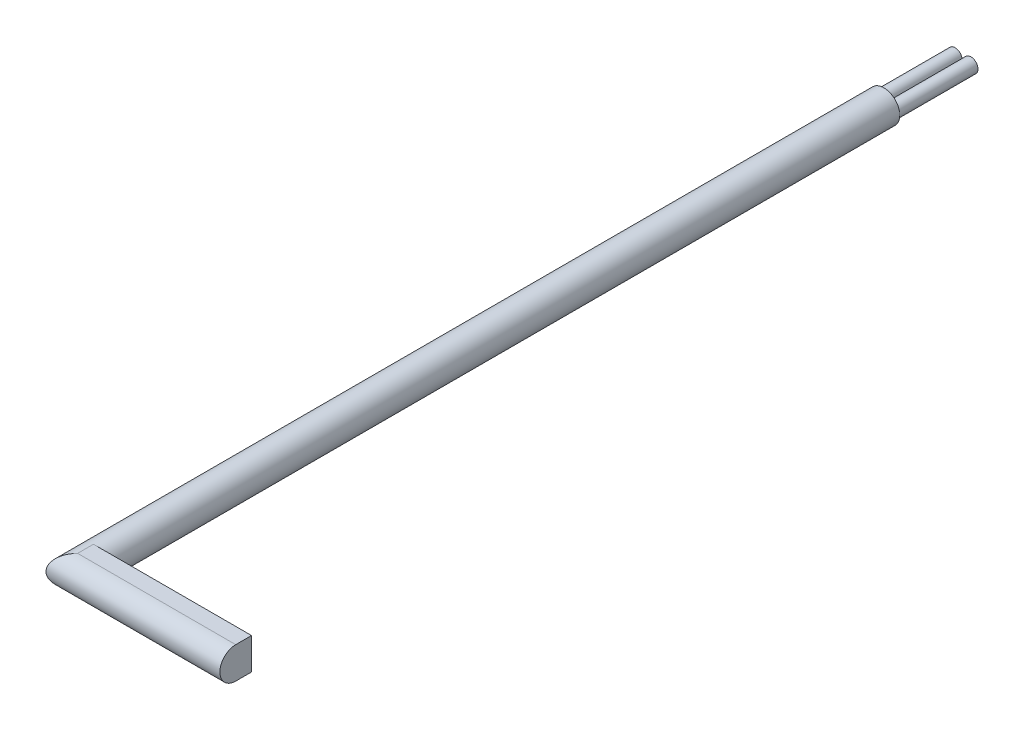
ISO-10303-21;
HEADER;
FILE_DESCRIPTION(('STEP AP214'),'2;1');
FILE_NAME('part.step','',(''),(''),'','','');
FILE_SCHEMA(('AUTOMOTIVE_DESIGN { 1 0 10303 214 1 1 1 1 }'));
ENDSEC;
DATA;
#1=APPLICATION_CONTEXT('core data for automotive mechanical design processes');
#2=APPLICATION_PROTOCOL_DEFINITION('international standard','automotive_design',2000,#1);
#3=PRODUCT_CONTEXT('',#1,'mechanical');
#4=PRODUCT('Part','Part','',(#3));
#5=PRODUCT_RELATED_PRODUCT_CATEGORY('part','',(#4));
#6=PRODUCT_DEFINITION_FORMATION('','',#4);
#7=PRODUCT_DEFINITION_CONTEXT('part definition',#1,'design');
#8=PRODUCT_DEFINITION('design','',#6,#7);
#9=PRODUCT_DEFINITION_SHAPE('','',#8);
#10=(LENGTH_UNIT() NAMED_UNIT(*) SI_UNIT(.MILLI.,.METRE.));
#11=(NAMED_UNIT(*) PLANE_ANGLE_UNIT() SI_UNIT($,.RADIAN.));
#12=(NAMED_UNIT(*) SI_UNIT($,.STERADIAN.) SOLID_ANGLE_UNIT());
#13=UNCERTAINTY_MEASURE_WITH_UNIT(LENGTH_MEASURE(1.E-05),#10,'distance_accuracy_value','');
#14=(GEOMETRIC_REPRESENTATION_CONTEXT(3) GLOBAL_UNCERTAINTY_ASSIGNED_CONTEXT((#13)) GLOBAL_UNIT_ASSIGNED_CONTEXT((#10,
#11,#12)) REPRESENTATION_CONTEXT('',''));
#15=CARTESIAN_POINT('',(0.,0.,0.));
#16=DIRECTION('',(0.,0.,1.));
#17=DIRECTION('',(1.,0.,0.));
#18=AXIS2_PLACEMENT_3D('',#15,#16,#17);
#19=CARTESIAN_POINT('',(0.,0.,0.));
#20=DIRECTION('',(0.,0.,1.));
#21=DIRECTION('',(1.,0.,0.));
#22=AXIS2_PLACEMENT_3D('',#19,#20,#21);
#23=PLANE('',#22);
#24=CARTESIAN_POINT('',(-0.5,0.,0.));
#25=DIRECTION('',(0.,0.,1.));
#26=DIRECTION('',(1.,0.,0.));
#27=AXIS2_PLACEMENT_3D('',#24,#25,#26);
#28=CIRCLE('',#27,0.45);
#29=CARTESIAN_POINT('',(-0.0500000000000001,0.,0.));
#30=VERTEX_POINT('',#29);
#31=EDGE_CURVE('E62',#30,#30,#28,.F.);
#32=ORIENTED_EDGE('',*,*,#31,.F.);
#33=EDGE_LOOP('',(#32));
#34=FACE_BOUND('',#33,.T.);
#35=CARTESIAN_POINT('',(0.,0.,0.));
#36=DIRECTION('',(0.,0.,1.));
#37=DIRECTION('',(1.,0.,0.));
#38=AXIS2_PLACEMENT_3D('',#35,#36,#37);
#39=CIRCLE('',#38,1.);
#40=CARTESIAN_POINT('',(1.,0.,0.));
#41=VERTEX_POINT('',#40);
#42=EDGE_CURVE('E115',#41,#41,#39,.T.);
#43=ORIENTED_EDGE('',*,*,#42,.F.);
#44=EDGE_LOOP('',(#43));
#45=FACE_BOUND('',#44,.T.);
#46=CARTESIAN_POINT('',(0.5,0.,0.));
#47=DIRECTION('',(0.,0.,1.));
#48=DIRECTION('',(1.,0.,0.));
#49=AXIS2_PLACEMENT_3D('',#46,#47,#48);
#50=CIRCLE('',#49,0.45);
#51=CARTESIAN_POINT('',(0.95,0.,0.));
#52=VERTEX_POINT('',#51);
#53=EDGE_CURVE('E12',#52,#52,#50,.F.);
#54=ORIENTED_EDGE('',*,*,#53,.F.);
#55=EDGE_LOOP('',(#54));
#56=FACE_BOUND('',#55,.T.);
#57=ADVANCED_FACE('F54',(#34,#45,#56),#23,.F.);
#58=CARTESIAN_POINT('',(0.,0.,50.));
#59=DIRECTION('',(0.,0.,-1.));
#60=DIRECTION('',(-1.,0.,0.));
#61=AXIS2_PLACEMENT_3D('',#58,#59,#60);
#62=CYLINDRICAL_SURFACE('',#61,1.);
#63=ORIENTED_EDGE('',*,*,#42,.T.);
#64=EDGE_LOOP('',(#63));
#65=FACE_BOUND('',#64,.T.);
#66=DIRECTION('',(0.,0.,-1.));
#67=VECTOR('',#66,1.);
#68=CARTESIAN_POINT('',(0.,-0.999999999999999,52.));
#69=LINE('',#68,#67);
#70=CARTESIAN_POINT('',(0.,-0.999999999999999,51.));
#71=VERTEX_POINT('',#70);
#72=CARTESIAN_POINT('',(0.,-0.999999999999999,50.));
#73=VERTEX_POINT('',#72);
#74=EDGE_CURVE('E113',#71,#73,#69,.T.);
#75=ORIENTED_EDGE('',*,*,#74,.F.);
#76=CARTESIAN_POINT('',(0.,0.,51.));
#77=DIRECTION('',(0.707106781186547,0.,0.707106781186547));
#78=DIRECTION('',(0.707106781186547,0.,-0.707106781186547));
#79=AXIS2_PLACEMENT_3D('',#76,#77,#78);
#80=ELLIPSE('',#79,1.4142135623731,1.);
#81=CARTESIAN_POINT('',(0.,1.,51.));
#82=VERTEX_POINT('',#81);
#83=EDGE_CURVE('E99',#71,#82,#80,.F.);
#84=ORIENTED_EDGE('',*,*,#83,.T.);
#85=DIRECTION('',(0.,0.,-1.));
#86=VECTOR('',#85,1.);
#87=CARTESIAN_POINT('',(0.,1.,52.));
#88=LINE('',#87,#86);
#89=CARTESIAN_POINT('',(0.,1.,50.));
#90=VERTEX_POINT('',#89);
#91=EDGE_CURVE('E117',#82,#90,#88,.T.);
#92=ORIENTED_EDGE('',*,*,#91,.T.);
#93=CARTESIAN_POINT('',(0.,0.,50.));
#94=DIRECTION('',(0.,0.,1.));
#95=DIRECTION('',(1.,0.,0.));
#96=AXIS2_PLACEMENT_3D('',#93,#94,#95);
#97=CIRCLE('',#96,1.);
#98=EDGE_CURVE('E121',#73,#90,#97,.T.);
#99=ORIENTED_EDGE('',*,*,#98,.F.);
#100=EDGE_LOOP('',(#75,#84,#92,#99));
#101=FACE_BOUND('',#100,.T.);
#102=ADVANCED_FACE('F56',(#65,#101),#62,.T.);
#103=CARTESIAN_POINT('',(10.,1.,52.));
#104=DIRECTION('',(-1.,0.,0.));
#105=DIRECTION('',(0.,0.,1.));
#106=AXIS2_PLACEMENT_3D('',#103,#104,#105);
#107=PLANE('',#106);
#108=CARTESIAN_POINT('',(10.,0.,51.));
#109=DIRECTION('',(1.,0.,0.));
#110=DIRECTION('',(0.,0.,-1.));
#111=AXIS2_PLACEMENT_3D('',#108,#109,#110);
#112=CIRCLE('',#111,1.);
#113=CARTESIAN_POINT('',(10.,1.,51.));
#114=VERTEX_POINT('',#113);
#115=CARTESIAN_POINT('',(10.,-0.999999999999999,51.));
#116=VERTEX_POINT('',#115);
#117=EDGE_CURVE('E94',#114,#116,#112,.T.);
#118=ORIENTED_EDGE('',*,*,#117,.T.);
#119=DIRECTION('',(0.,0.,-1.));
#120=VECTOR('',#119,1.);
#121=CARTESIAN_POINT('',(10.,-0.999999999999999,52.));
#122=LINE('',#121,#120);
#123=CARTESIAN_POINT('',(10.,-0.999999999999999,50.));
#124=VERTEX_POINT('',#123);
#125=EDGE_CURVE('E76',#116,#124,#122,.T.);
#126=ORIENTED_EDGE('',*,*,#125,.T.);
#127=DIRECTION('',(0.,1.,0.));
#128=VECTOR('',#127,1.);
#129=CARTESIAN_POINT('',(10.,1.,50.));
#130=LINE('',#129,#128);
#131=CARTESIAN_POINT('',(10.,1.,50.));
#132=VERTEX_POINT('',#131);
#133=EDGE_CURVE('E247',#124,#132,#130,.T.);
#134=ORIENTED_EDGE('',*,*,#133,.T.);
#135=DIRECTION('',(0.,0.,-1.));
#136=VECTOR('',#135,1.);
#137=CARTESIAN_POINT('',(10.,1.,52.));
#138=LINE('',#137,#136);
#139=EDGE_CURVE('E69',#114,#132,#138,.T.);
#140=ORIENTED_EDGE('',*,*,#139,.F.);
#141=EDGE_LOOP('',(#118,#126,#134,#140));
#142=FACE_BOUND('',#141,.T.);
#143=ADVANCED_FACE('F96',(#142),#107,.F.);
#144=CARTESIAN_POINT('',(0.,-0.999999999999999,52.));
#145=DIRECTION('',(0.,1.,0.));
#146=DIRECTION('',(0.,0.,1.));
#147=AXIS2_PLACEMENT_3D('',#144,#145,#146);
#148=PLANE('',#147);
#149=DIRECTION('',(1.,0.,0.));
#150=VECTOR('',#149,1.);
#151=CARTESIAN_POINT('',(-1.001,-0.999999999999999,51.));
#152=LINE('',#151,#150);
#153=EDGE_CURVE('E102',#71,#116,#152,.T.);
#154=ORIENTED_EDGE('',*,*,#153,.F.);
#155=ORIENTED_EDGE('',*,*,#74,.T.);
#156=DIRECTION('',(1.,0.,0.));
#157=VECTOR('',#156,1.);
#158=CARTESIAN_POINT('',(0.,-0.999999999999999,50.));
#159=LINE('',#158,#157);
#160=EDGE_CURVE('E111',#73,#124,#159,.T.);
#161=ORIENTED_EDGE('',*,*,#160,.T.);
#162=ORIENTED_EDGE('',*,*,#125,.F.);
#163=EDGE_LOOP('',(#154,#155,#161,#162));
#164=FACE_BOUND('',#163,.T.);
#165=ADVANCED_FACE('F109',(#164),#148,.F.);
#166=CARTESIAN_POINT('',(0.,-0.999999999999999,50.));
#167=DIRECTION('',(0.,0.,1.));
#168=DIRECTION('',(1.,0.,0.));
#169=AXIS2_PLACEMENT_3D('',#166,#167,#168);
#170=PLANE('',#169);
#171=ORIENTED_EDGE('',*,*,#160,.F.);
#172=ORIENTED_EDGE('',*,*,#98,.T.);
#173=DIRECTION('',(-1.,0.,0.));
#174=VECTOR('',#173,1.);
#175=CARTESIAN_POINT('',(0.,1.,50.));
#176=LINE('',#175,#174);
#177=EDGE_CURVE('E249',#132,#90,#176,.T.);
#178=ORIENTED_EDGE('',*,*,#177,.F.);
#179=ORIENTED_EDGE('',*,*,#133,.F.);
#180=EDGE_LOOP('',(#171,#172,#178,#179));
#181=FACE_BOUND('',#180,.T.);
#182=ADVANCED_FACE('F158',(#181),#170,.F.);
#183=CARTESIAN_POINT('',(0.,1.,52.));
#184=DIRECTION('',(0.,-1.,0.));
#185=DIRECTION('',(0.,0.,-1.));
#186=AXIS2_PLACEMENT_3D('',#183,#184,#185);
#187=PLANE('',#186);
#188=ORIENTED_EDGE('',*,*,#91,.F.);
#189=DIRECTION('',(1.,0.,0.));
#190=VECTOR('',#189,1.);
#191=CARTESIAN_POINT('',(-1.001,1.,51.));
#192=LINE('',#191,#190);
#193=EDGE_CURVE('E98',#82,#114,#192,.T.);
#194=ORIENTED_EDGE('',*,*,#193,.T.);
#195=ORIENTED_EDGE('',*,*,#139,.T.);
#196=ORIENTED_EDGE('',*,*,#177,.T.);
#197=EDGE_LOOP('',(#188,#194,#195,#196));
#198=FACE_BOUND('',#197,.T.);
#199=ADVANCED_FACE('F157',(#198),#187,.F.);
#200=CARTESIAN_POINT('',(-1.001,0.,51.));
#201=DIRECTION('',(1.,0.,0.));
#202=DIRECTION('',(0.,0.,-1.));
#203=AXIS2_PLACEMENT_3D('',#200,#201,#202);
#204=CYLINDRICAL_SURFACE('',#203,1.);
#205=ORIENTED_EDGE('',*,*,#83,.F.);
#206=ORIENTED_EDGE('',*,*,#153,.T.);
#207=ORIENTED_EDGE('',*,*,#117,.F.);
#208=ORIENTED_EDGE('',*,*,#193,.F.);
#209=EDGE_LOOP('',(#205,#206,#207,#208));
#210=FACE_BOUND('',#209,.T.);
#211=ADVANCED_FACE('F103',(#210),#204,.T.);
#212=CARTESIAN_POINT('',(-0.5,0.,-5.));
#213=DIRECTION('',(0.,0.,1.));
#214=DIRECTION('',(1.,0.,0.));
#215=AXIS2_PLACEMENT_3D('',#212,#213,#214);
#216=CYLINDRICAL_SURFACE('',#215,0.45);
#217=CARTESIAN_POINT('',(-0.5,0.,-5.));
#218=DIRECTION('',(0.,0.,-1.));
#219=DIRECTION('',(-1.,0.,0.));
#220=AXIS2_PLACEMENT_3D('',#217,#218,#219);
#221=CIRCLE('',#220,0.45);
#222=CARTESIAN_POINT('',(-0.95,0.,-5.));
#223=VERTEX_POINT('',#222);
#224=EDGE_CURVE('E107',#223,#223,#221,.T.);
#225=ORIENTED_EDGE('',*,*,#224,.F.);
#226=EDGE_LOOP('',(#225));
#227=FACE_BOUND('',#226,.T.);
#228=ORIENTED_EDGE('',*,*,#31,.T.);
#229=EDGE_LOOP('',(#228));
#230=FACE_BOUND('',#229,.T.);
#231=ADVANCED_FACE('F128',(#227,#230),#216,.T.);
#232=CARTESIAN_POINT('',(-2.34142135623731,0.,-5.));
#233=DIRECTION('',(0.,0.,-1.));
#234=DIRECTION('',(-1.,0.,0.));
#235=AXIS2_PLACEMENT_3D('',#232,#233,#234);
#236=PLANE('',#235);
#237=ORIENTED_EDGE('',*,*,#224,.T.);
#238=EDGE_LOOP('',(#237));
#239=FACE_BOUND('',#238,.T.);
#240=ADVANCED_FACE('F139',(#239),#236,.T.);
#241=CARTESIAN_POINT('',(0.5,0.,-5.));
#242=DIRECTION('',(0.,0.,1.));
#243=DIRECTION('',(1.,0.,0.));
#244=AXIS2_PLACEMENT_3D('',#241,#242,#243);
#245=CYLINDRICAL_SURFACE('',#244,0.45);
#246=CARTESIAN_POINT('',(0.5,0.,-5.));
#247=DIRECTION('',(0.,0.,-1.));
#248=DIRECTION('',(-1.,0.,0.));
#249=AXIS2_PLACEMENT_3D('',#246,#247,#248);
#250=CIRCLE('',#249,0.45);
#251=CARTESIAN_POINT('',(0.05,0.,-5.));
#252=VERTEX_POINT('',#251);
#253=EDGE_CURVE('E257',#252,#252,#250,.T.);
#254=ORIENTED_EDGE('',*,*,#253,.F.);
#255=EDGE_LOOP('',(#254));
#256=FACE_BOUND('',#255,.T.);
#257=ORIENTED_EDGE('',*,*,#53,.T.);
#258=EDGE_LOOP('',(#257));
#259=FACE_BOUND('',#258,.T.);
#260=ADVANCED_FACE('F136',(#256,#259),#245,.T.);
#261=CARTESIAN_POINT('',(-2.34142135623731,0.,-5.));
#262=DIRECTION('',(0.,0.,-1.));
#263=DIRECTION('',(-1.,0.,0.));
#264=AXIS2_PLACEMENT_3D('',#261,#262,#263);
#265=PLANE('',#264);
#266=ORIENTED_EDGE('',*,*,#253,.T.);
#267=EDGE_LOOP('',(#266));
#268=FACE_BOUND('',#267,.T.);
#269=ADVANCED_FACE('F138',(#268),#265,.T.);
#270=CLOSED_SHELL('',(#57,#102,#143,#165,#182,#199,#211,#231,#240,#260,#269));
#271=MANIFOLD_SOLID_BREP('B2',#270);
#272=ADVANCED_BREP_SHAPE_REPRESENTATION('',(#18,#271),#14);
#273=SHAPE_DEFINITION_REPRESENTATION(#9,#272);
ENDSEC;
END-ISO-10303-21;
